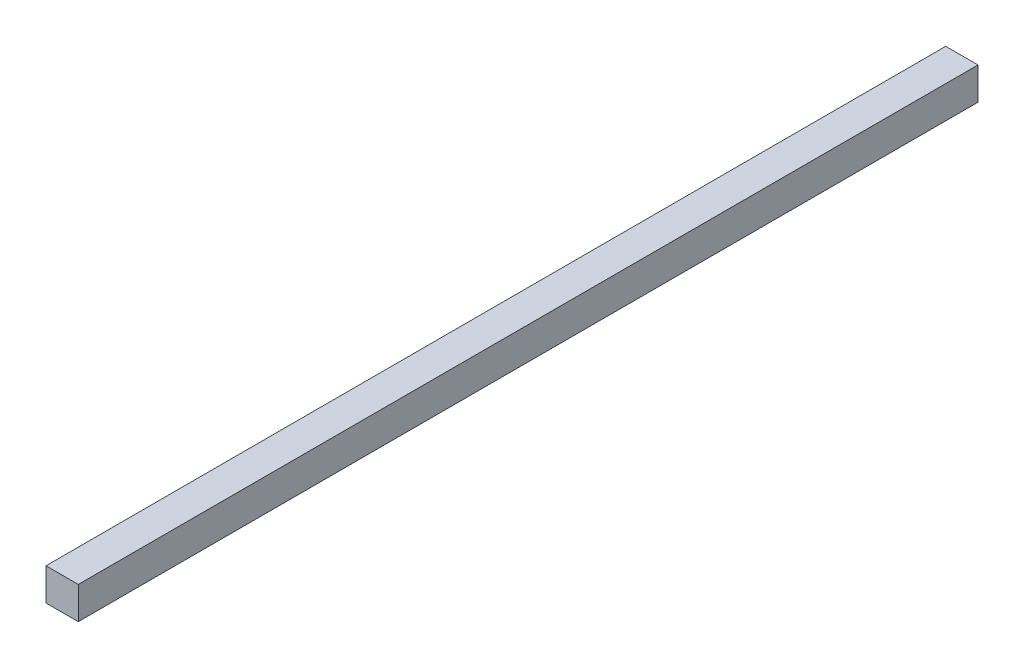
ISO-10303-21;
HEADER;
FILE_DESCRIPTION(('STEP AP214'),'2;1');
FILE_NAME('part.step','',(''),(''),'','','');
FILE_SCHEMA(('AUTOMOTIVE_DESIGN { 1 0 10303 214 1 1 1 1 }'));
ENDSEC;
DATA;
#1=APPLICATION_CONTEXT('core data for automotive mechanical design processes');
#2=APPLICATION_PROTOCOL_DEFINITION('international standard','automotive_design',2000,#1);
#3=PRODUCT_CONTEXT('',#1,'mechanical');
#4=PRODUCT('Part','Part','',(#3));
#5=PRODUCT_RELATED_PRODUCT_CATEGORY('part','',(#4));
#6=PRODUCT_DEFINITION_FORMATION('','',#4);
#7=PRODUCT_DEFINITION_CONTEXT('part definition',#1,'design');
#8=PRODUCT_DEFINITION('design','',#6,#7);
#9=PRODUCT_DEFINITION_SHAPE('','',#8);
#10=(LENGTH_UNIT() NAMED_UNIT(*) SI_UNIT(.MILLI.,.METRE.));
#11=(NAMED_UNIT(*) PLANE_ANGLE_UNIT() SI_UNIT($,.RADIAN.));
#12=(NAMED_UNIT(*) SI_UNIT($,.STERADIAN.) SOLID_ANGLE_UNIT());
#13=UNCERTAINTY_MEASURE_WITH_UNIT(LENGTH_MEASURE(1.E-05),#10,'distance_accuracy_value','');
#14=(GEOMETRIC_REPRESENTATION_CONTEXT(3) GLOBAL_UNCERTAINTY_ASSIGNED_CONTEXT((#13)) GLOBAL_UNIT_ASSIGNED_CONTEXT((#10,
#11,#12)) REPRESENTATION_CONTEXT('',''));
#15=CARTESIAN_POINT('',(0.,0.,0.));
#16=DIRECTION('',(0.,0.,1.));
#17=DIRECTION('',(1.,0.,0.));
#18=AXIS2_PLACEMENT_3D('',#15,#16,#17);
#19=CARTESIAN_POINT('',(-7.41771303477126,18.3569121082568,400.));
#20=DIRECTION('',(-1.,0.,0.));
#21=DIRECTION('',(0.,0.,1.));
#22=AXIS2_PLACEMENT_3D('',#19,#20,#21);
#23=PLANE('',#22);
#24=DIRECTION('',(0.,1.,0.));
#25=VECTOR('',#24,1.);
#26=CARTESIAN_POINT('',(-7.41771303477126,18.3569121082568,0.));
#27=LINE('',#26,#25);
#28=CARTESIAN_POINT('',(-7.41771303477126,4.00789345083036,0.));
#29=VERTEX_POINT('',#28);
#30=CARTESIAN_POINT('',(-7.41771303477126,18.3569121082568,0.));
#31=VERTEX_POINT('',#30);
#32=EDGE_CURVE('E104',#29,#31,#27,.T.);
#33=ORIENTED_EDGE('',*,*,#32,.T.);
#34=DIRECTION('',(0.,0.,-1.));
#35=VECTOR('',#34,1.);
#36=CARTESIAN_POINT('',(-7.41771303477126,18.3569121082568,400.));
#37=LINE('',#36,#35);
#38=CARTESIAN_POINT('',(-7.41771303477126,18.3569121082568,400.));
#39=VERTEX_POINT('',#38);
#40=EDGE_CURVE('E11',#39,#31,#37,.T.);
#41=ORIENTED_EDGE('',*,*,#40,.F.);
#42=DIRECTION('',(0.,1.,0.));
#43=VECTOR('',#42,1.);
#44=CARTESIAN_POINT('',(-7.41771303477126,18.3569121082568,400.));
#45=LINE('',#44,#43);
#46=CARTESIAN_POINT('',(-7.41771303477126,4.00789345083036,400.));
#47=VERTEX_POINT('',#46);
#48=EDGE_CURVE('E92',#47,#39,#45,.T.);
#49=ORIENTED_EDGE('',*,*,#48,.F.);
#50=DIRECTION('',(0.,0.,-1.));
#51=VECTOR('',#50,1.);
#52=CARTESIAN_POINT('',(-7.41771303477126,4.00789345083036,400.));
#53=LINE('',#52,#51);
#54=EDGE_CURVE('E100',#47,#29,#53,.T.);
#55=ORIENTED_EDGE('',*,*,#54,.T.);
#56=EDGE_LOOP('',(#33,#41,#49,#55));
#57=FACE_BOUND('',#56,.T.);
#58=ADVANCED_FACE('F41',(#57),#23,.F.);
#59=CARTESIAN_POINT('',(-21.7667316921976,18.3569121082568,400.));
#60=DIRECTION('',(0.,-1.,0.));
#61=DIRECTION('',(0.,0.,-1.));
#62=AXIS2_PLACEMENT_3D('',#59,#60,#61);
#63=PLANE('',#62);
#64=DIRECTION('',(-1.,0.,0.));
#65=VECTOR('',#64,1.);
#66=CARTESIAN_POINT('',(-21.7667316921976,18.3569121082568,0.));
#67=LINE('',#66,#65);
#68=CARTESIAN_POINT('',(-21.7667316921976,18.3569121082568,0.));
#69=VERTEX_POINT('',#68);
#70=EDGE_CURVE('E96',#31,#69,#67,.T.);
#71=ORIENTED_EDGE('',*,*,#70,.T.);
#72=DIRECTION('',(0.,0.,-1.));
#73=VECTOR('',#72,1.);
#74=CARTESIAN_POINT('',(-21.7667316921976,18.3569121082568,400.));
#75=LINE('',#74,#73);
#76=CARTESIAN_POINT('',(-21.7667316921976,18.3569121082568,400.));
#77=VERTEX_POINT('',#76);
#78=EDGE_CURVE('E49',#77,#69,#75,.T.);
#79=ORIENTED_EDGE('',*,*,#78,.F.);
#80=DIRECTION('',(-1.,0.,0.));
#81=VECTOR('',#80,1.);
#82=CARTESIAN_POINT('',(-21.7667316921976,18.3569121082568,400.));
#83=LINE('',#82,#81);
#84=EDGE_CURVE('E87',#39,#77,#83,.T.);
#85=ORIENTED_EDGE('',*,*,#84,.F.);
#86=ORIENTED_EDGE('',*,*,#40,.T.);
#87=EDGE_LOOP('',(#71,#79,#85,#86));
#88=FACE_BOUND('',#87,.T.);
#89=ADVANCED_FACE('F95',(#88),#63,.F.);
#90=CARTESIAN_POINT('',(-21.7667316921976,18.3569121082568,400.));
#91=DIRECTION('',(1.,0.,0.));
#92=DIRECTION('',(0.,0.,-1.));
#93=AXIS2_PLACEMENT_3D('',#90,#91,#92);
#94=PLANE('',#93);
#95=DIRECTION('',(0.,-1.,0.));
#96=VECTOR('',#95,1.);
#97=CARTESIAN_POINT('',(-21.7667316921976,18.3569121082568,0.));
#98=LINE('',#97,#96);
#99=CARTESIAN_POINT('',(-21.7667316921976,4.00789345083036,0.));
#100=VERTEX_POINT('',#99);
#101=EDGE_CURVE('E74',#69,#100,#98,.T.);
#102=ORIENTED_EDGE('',*,*,#101,.T.);
#103=DIRECTION('',(0.,0.,-1.));
#104=VECTOR('',#103,1.);
#105=CARTESIAN_POINT('',(-21.7667316921976,4.00789345083036,400.));
#106=LINE('',#105,#104);
#107=CARTESIAN_POINT('',(-21.7667316921976,4.00789345083036,400.));
#108=VERTEX_POINT('',#107);
#109=EDGE_CURVE('E97',#108,#100,#106,.T.);
#110=ORIENTED_EDGE('',*,*,#109,.F.);
#111=DIRECTION('',(0.,-1.,0.));
#112=VECTOR('',#111,1.);
#113=CARTESIAN_POINT('',(-21.7667316921976,18.3569121082568,400.));
#114=LINE('',#113,#112);
#115=EDGE_CURVE('E90',#77,#108,#114,.T.);
#116=ORIENTED_EDGE('',*,*,#115,.F.);
#117=ORIENTED_EDGE('',*,*,#78,.T.);
#118=EDGE_LOOP('',(#102,#110,#116,#117));
#119=FACE_BOUND('',#118,.T.);
#120=ADVANCED_FACE('F98',(#119),#94,.F.);
#121=CARTESIAN_POINT('',(-21.7667316921976,4.00789345083036,400.));
#122=DIRECTION('',(0.,1.,0.));
#123=DIRECTION('',(0.,0.,1.));
#124=AXIS2_PLACEMENT_3D('',#121,#122,#123);
#125=PLANE('',#124);
#126=DIRECTION('',(1.,0.,0.));
#127=VECTOR('',#126,1.);
#128=CARTESIAN_POINT('',(-21.7667316921976,4.00789345083036,0.));
#129=LINE('',#128,#127);
#130=EDGE_CURVE('E80',#100,#29,#129,.T.);
#131=ORIENTED_EDGE('',*,*,#130,.T.);
#132=ORIENTED_EDGE('',*,*,#54,.F.);
#133=DIRECTION('',(1.,0.,0.));
#134=VECTOR('',#133,1.);
#135=CARTESIAN_POINT('',(-21.7667316921976,4.00789345083036,400.));
#136=LINE('',#135,#134);
#137=EDGE_CURVE('E57',#108,#47,#136,.T.);
#138=ORIENTED_EDGE('',*,*,#137,.F.);
#139=ORIENTED_EDGE('',*,*,#109,.T.);
#140=EDGE_LOOP('',(#131,#132,#138,#139));
#141=FACE_BOUND('',#140,.T.);
#142=ADVANCED_FACE('F111',(#141),#125,.F.);
#143=CARTESIAN_POINT('',(0.,0.,400.));
#144=DIRECTION('',(0.,0.,1.));
#145=DIRECTION('',(1.,0.,0.));
#146=AXIS2_PLACEMENT_3D('',#143,#144,#145);
#147=PLANE('',#146);
#148=ORIENTED_EDGE('',*,*,#48,.T.);
#149=ORIENTED_EDGE('',*,*,#84,.T.);
#150=ORIENTED_EDGE('',*,*,#115,.T.);
#151=ORIENTED_EDGE('',*,*,#137,.T.);
#152=EDGE_LOOP('',(#148,#149,#150,#151));
#153=FACE_BOUND('',#152,.T.);
#154=ADVANCED_FACE('F88',(#153),#147,.T.);
#155=CARTESIAN_POINT('',(0.,0.,0.));
#156=DIRECTION('',(0.,0.,1.));
#157=DIRECTION('',(1.,0.,0.));
#158=AXIS2_PLACEMENT_3D('',#155,#156,#157);
#159=PLANE('',#158);
#160=ORIENTED_EDGE('',*,*,#32,.F.);
#161=ORIENTED_EDGE('',*,*,#130,.F.);
#162=ORIENTED_EDGE('',*,*,#101,.F.);
#163=ORIENTED_EDGE('',*,*,#70,.F.);
#164=EDGE_LOOP('',(#160,#161,#162,#163));
#165=FACE_BOUND('',#164,.T.);
#166=ADVANCED_FACE('F114',(#165),#159,.F.);
#167=CLOSED_SHELL('',(#58,#89,#120,#142,#154,#166));
#168=MANIFOLD_SOLID_BREP('B2',#167);
#169=ADVANCED_BREP_SHAPE_REPRESENTATION('',(#18,#168),#14);
#170=SHAPE_DEFINITION_REPRESENTATION(#9,#169);
ENDSEC;
END-ISO-10303-21;
